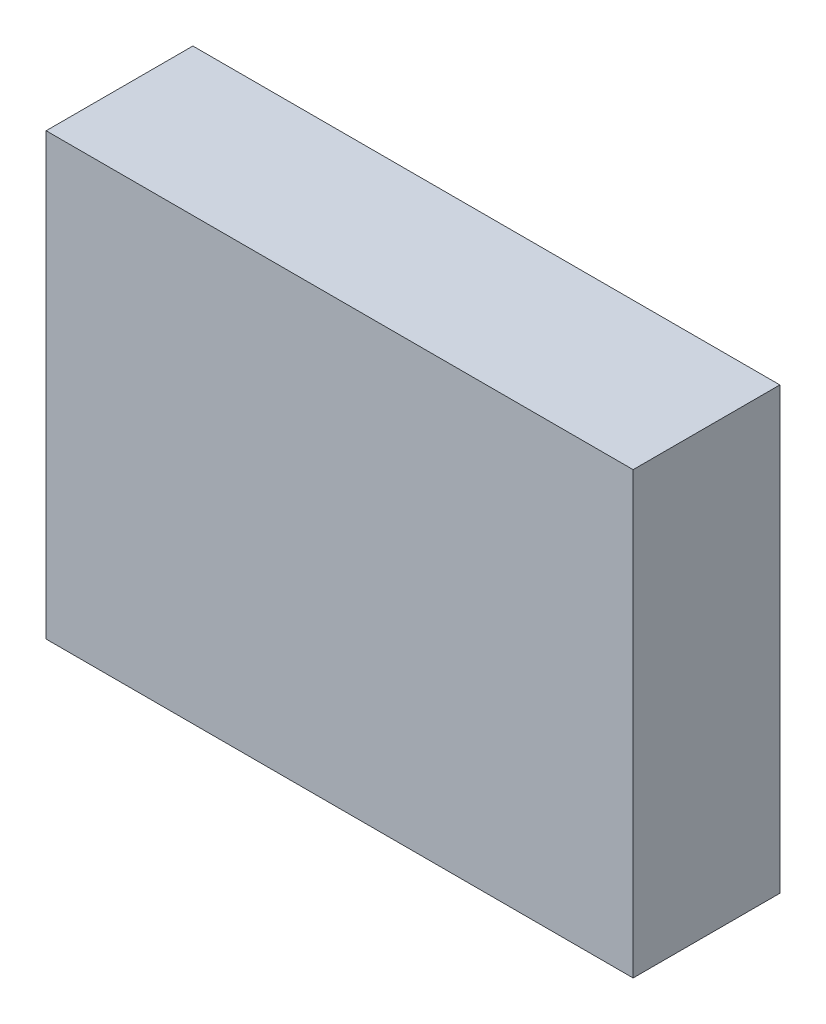
ISO-10303-21;
HEADER;
FILE_DESCRIPTION(('STEP AP214'),'2;1');
FILE_NAME('part.step','',(''),(''),'','','');
FILE_SCHEMA(('AUTOMOTIVE_DESIGN { 1 0 10303 214 1 1 1 1 }'));
ENDSEC;
DATA;
#1=APPLICATION_CONTEXT('core data for automotive mechanical design processes');
#2=APPLICATION_PROTOCOL_DEFINITION('international standard','automotive_design',2000,#1);
#3=PRODUCT_CONTEXT('',#1,'mechanical');
#4=PRODUCT('Part','Part','',(#3));
#5=PRODUCT_RELATED_PRODUCT_CATEGORY('part','',(#4));
#6=PRODUCT_DEFINITION_FORMATION('','',#4);
#7=PRODUCT_DEFINITION_CONTEXT('part definition',#1,'design');
#8=PRODUCT_DEFINITION('design','',#6,#7);
#9=PRODUCT_DEFINITION_SHAPE('','',#8);
#10=(LENGTH_UNIT() NAMED_UNIT(*) SI_UNIT(.MILLI.,.METRE.));
#11=(NAMED_UNIT(*) PLANE_ANGLE_UNIT() SI_UNIT($,.RADIAN.));
#12=(NAMED_UNIT(*) SI_UNIT($,.STERADIAN.) SOLID_ANGLE_UNIT());
#13=UNCERTAINTY_MEASURE_WITH_UNIT(LENGTH_MEASURE(1.E-05),#10,'distance_accuracy_value','');
#14=(GEOMETRIC_REPRESENTATION_CONTEXT(3) GLOBAL_UNCERTAINTY_ASSIGNED_CONTEXT((#13)) GLOBAL_UNIT_ASSIGNED_CONTEXT((#10,
#11,#12)) REPRESENTATION_CONTEXT('',''));
#15=CARTESIAN_POINT('',(0.,0.,0.));
#16=DIRECTION('',(0.,0.,1.));
#17=DIRECTION('',(1.,0.,0.));
#18=AXIS2_PLACEMENT_3D('',#15,#16,#17);
#19=CARTESIAN_POINT('',(-300.,0.,0.));
#20=DIRECTION('',(0.,-1.,0.));
#21=DIRECTION('',(0.,0.,-1.));
#22=AXIS2_PLACEMENT_3D('',#19,#20,#21);
#23=PLANE('',#22);
#24=DIRECTION('',(1.,0.,0.));
#25=VECTOR('',#24,1.);
#26=CARTESIAN_POINT('',(-300.,0.,150.));
#27=LINE('',#26,#25);
#28=CARTESIAN_POINT('',(-300.,0.,150.));
#29=VERTEX_POINT('',#28);
#30=CARTESIAN_POINT('',(300.,0.,150.));
#31=VERTEX_POINT('',#30);
#32=EDGE_CURVE('E46',#29,#31,#27,.T.);
#33=ORIENTED_EDGE('',*,*,#32,.T.);
#34=DIRECTION('',(0.,0.,-1.));
#35=VECTOR('',#34,1.);
#36=CARTESIAN_POINT('',(300.,0.,0.));
#37=LINE('',#36,#35);
#38=CARTESIAN_POINT('',(300.,0.,0.));
#39=VERTEX_POINT('',#38);
#40=EDGE_CURVE('E190',#31,#39,#37,.T.);
#41=ORIENTED_EDGE('',*,*,#40,.T.);
#42=DIRECTION('',(1.,0.,0.));
#43=VECTOR('',#42,1.);
#44=CARTESIAN_POINT('',(-300.,0.,0.));
#45=LINE('',#44,#43);
#46=CARTESIAN_POINT('',(-300.,0.,0.));
#47=VERTEX_POINT('',#46);
#48=EDGE_CURVE('E11',#47,#39,#45,.T.);
#49=ORIENTED_EDGE('',*,*,#48,.F.);
#50=DIRECTION('',(0.,0.,-1.));
#51=VECTOR('',#50,1.);
#52=CARTESIAN_POINT('',(-300.,0.,0.));
#53=LINE('',#52,#51);
#54=EDGE_CURVE('E56',#29,#47,#53,.T.);
#55=ORIENTED_EDGE('',*,*,#54,.F.);
#56=EDGE_LOOP('',(#33,#41,#49,#55));
#57=FACE_BOUND('',#56,.T.);
#58=ADVANCED_FACE('F43',(#57),#23,.F.);
#59=CARTESIAN_POINT('',(-300.,0.,0.));
#60=DIRECTION('',(0.,0.,-1.));
#61=DIRECTION('',(0.,1.,0.));
#62=AXIS2_PLACEMENT_3D('',#59,#60,#61);
#63=PLANE('',#62);
#64=CARTESIAN_POINT('',(-14.9999999999999,-87.5000000000001,0.));
#65=DIRECTION('',(0.,0.,-1.));
#66=DIRECTION('',(0.,1.,0.));
#67=AXIS2_PLACEMENT_3D('',#64,#65,#66);
#68=CIRCLE('',#67,1.025);
#69=CARTESIAN_POINT('',(-14.9999999999999,-86.4750000000001,0.));
#70=VERTEX_POINT('',#69);
#71=EDGE_CURVE('E121',#70,#70,#68,.T.);
#72=ORIENTED_EDGE('',*,*,#71,.F.);
#73=EDGE_LOOP('',(#72));
#74=FACE_BOUND('',#73,.T.);
#75=CARTESIAN_POINT('',(15.,-87.5000000000001,0.));
#76=DIRECTION('',(0.,0.,-1.));
#77=DIRECTION('',(0.,1.,0.));
#78=AXIS2_PLACEMENT_3D('',#75,#76,#77);
#79=CIRCLE('',#78,1.025);
#80=CARTESIAN_POINT('',(15.,-86.4750000000001,0.));
#81=VERTEX_POINT('',#80);
#82=EDGE_CURVE('E120',#81,#81,#79,.T.);
#83=ORIENTED_EDGE('',*,*,#82,.F.);
#84=EDGE_LOOP('',(#83));
#85=FACE_BOUND('',#84,.T.);
#86=CARTESIAN_POINT('',(15.,-12.5,0.));
#87=DIRECTION('',(0.,0.,-1.));
#88=DIRECTION('',(0.,1.,0.));
#89=AXIS2_PLACEMENT_3D('',#86,#87,#88);
#90=CIRCLE('',#89,1.025);
#91=CARTESIAN_POINT('',(15.,-11.475,0.));
#92=VERTEX_POINT('',#91);
#93=EDGE_CURVE('E133',#92,#92,#90,.T.);
#94=ORIENTED_EDGE('',*,*,#93,.F.);
#95=EDGE_LOOP('',(#94));
#96=FACE_BOUND('',#95,.T.);
#97=CARTESIAN_POINT('',(-14.9999999999999,-12.5,0.));
#98=DIRECTION('',(0.,0.,-1.));
#99=DIRECTION('',(0.,1.,0.));
#100=AXIS2_PLACEMENT_3D('',#97,#98,#99);
#101=CIRCLE('',#100,1.025);
#102=CARTESIAN_POINT('',(-14.9999999999999,-11.475,0.));
#103=VERTEX_POINT('',#102);
#104=EDGE_CURVE('E145',#103,#103,#101,.T.);
#105=ORIENTED_EDGE('',*,*,#104,.F.);
#106=EDGE_LOOP('',(#105));
#107=FACE_BOUND('',#106,.T.);
#108=CARTESIAN_POINT('',(-37.5,-305.,1.4767218602E-13));
#109=DIRECTION('',(0.,0.,-1.));
#110=DIRECTION('',(0.,1.,0.));
#111=AXIS2_PLACEMENT_3D('',#108,#109,#110);
#112=CIRCLE('',#111,1.025);
#113=CARTESIAN_POINT('',(-37.5,-303.975,1.4717008083235E-13));
#114=VERTEX_POINT('',#113);
#115=EDGE_CURVE('E151',#114,#114,#112,.T.);
#116=ORIENTED_EDGE('',*,*,#115,.F.);
#117=EDGE_LOOP('',(#116));
#118=FACE_BOUND('',#117,.T.);
#119=CARTESIAN_POINT('',(-37.5,-145.,0.));
#120=DIRECTION('',(0.,0.,-1.));
#121=DIRECTION('',(0.,1.,0.));
#122=AXIS2_PLACEMENT_3D('',#119,#120,#121);
#123=CIRCLE('',#122,1.025);
#124=CARTESIAN_POINT('',(-37.5,-143.975,0.));
#125=VERTEX_POINT('',#124);
#126=EDGE_CURVE('E156',#125,#125,#123,.T.);
#127=ORIENTED_EDGE('',*,*,#126,.F.);
#128=EDGE_LOOP('',(#127));
#129=FACE_BOUND('',#128,.T.);
#130=CARTESIAN_POINT('',(37.5,-305.,1.4767218602E-13));
#131=DIRECTION('',(0.,0.,-1.));
#132=DIRECTION('',(0.,1.,0.));
#133=AXIS2_PLACEMENT_3D('',#130,#131,#132);
#134=CIRCLE('',#133,1.025);
#135=CARTESIAN_POINT('',(37.5,-303.975,1.4717008083235E-13));
#136=VERTEX_POINT('',#135);
#137=EDGE_CURVE('E169',#136,#136,#134,.T.);
#138=ORIENTED_EDGE('',*,*,#137,.F.);
#139=EDGE_LOOP('',(#138));
#140=FACE_BOUND('',#139,.T.);
#141=CARTESIAN_POINT('',(37.5,-145.,0.));
#142=DIRECTION('',(0.,0.,-1.));
#143=DIRECTION('',(0.,1.,0.));
#144=AXIS2_PLACEMENT_3D('',#141,#142,#143);
#145=CIRCLE('',#144,1.025);
#146=CARTESIAN_POINT('',(37.5,-143.975,0.));
#147=VERTEX_POINT('',#146);
#148=EDGE_CURVE('E178',#147,#147,#145,.T.);
#149=ORIENTED_EDGE('',*,*,#148,.F.);
#150=EDGE_LOOP('',(#149));
#151=FACE_BOUND('',#150,.T.);
#152=ORIENTED_EDGE('',*,*,#48,.T.);
#153=DIRECTION('',(0.,1.,0.));
#154=VECTOR('',#153,1.);
#155=CARTESIAN_POINT('',(300.,0.,0.));
#156=LINE('',#155,#154);
#157=CARTESIAN_POINT('',(300.,-450.,0.));
#158=VERTEX_POINT('',#157);
#159=EDGE_CURVE('E196',#158,#39,#156,.T.);
#160=ORIENTED_EDGE('',*,*,#159,.F.);
#161=DIRECTION('',(1.,0.,0.));
#162=VECTOR('',#161,1.);
#163=CARTESIAN_POINT('',(-300.,-450.,0.));
#164=LINE('',#163,#162);
#165=CARTESIAN_POINT('',(-300.,-450.,0.));
#166=VERTEX_POINT('',#165);
#167=EDGE_CURVE('E51',#166,#158,#164,.T.);
#168=ORIENTED_EDGE('',*,*,#167,.F.);
#169=DIRECTION('',(0.,1.,0.));
#170=VECTOR('',#169,1.);
#171=CARTESIAN_POINT('',(-300.,0.,0.));
#172=LINE('',#171,#170);
#173=EDGE_CURVE('E204',#166,#47,#172,.T.);
#174=ORIENTED_EDGE('',*,*,#173,.T.);
#175=EDGE_LOOP('',(#152,#160,#168,#174));
#176=FACE_BOUND('',#175,.T.);
#177=ADVANCED_FACE('F221',(#74,#85,#96,#107,#118,#129,#140,#151,#176),#63,.T.);
#178=CARTESIAN_POINT('',(-300.,-450.,0.));
#179=DIRECTION('',(0.,-1.,0.));
#180=DIRECTION('',(0.,0.,-1.));
#181=AXIS2_PLACEMENT_3D('',#178,#179,#180);
#182=PLANE('',#181);
#183=ORIENTED_EDGE('',*,*,#167,.T.);
#184=DIRECTION('',(0.,0.,-1.));
#185=VECTOR('',#184,1.);
#186=CARTESIAN_POINT('',(300.,-450.,0.));
#187=LINE('',#186,#185);
#188=CARTESIAN_POINT('',(300.,-450.,150.));
#189=VERTEX_POINT('',#188);
#190=EDGE_CURVE('E192',#189,#158,#187,.T.);
#191=ORIENTED_EDGE('',*,*,#190,.F.);
#192=DIRECTION('',(1.,0.,0.));
#193=VECTOR('',#192,1.);
#194=CARTESIAN_POINT('',(-300.,-450.,150.));
#195=LINE('',#194,#193);
#196=CARTESIAN_POINT('',(-300.,-450.,150.));
#197=VERTEX_POINT('',#196);
#198=EDGE_CURVE('E207',#197,#189,#195,.T.);
#199=ORIENTED_EDGE('',*,*,#198,.F.);
#200=DIRECTION('',(0.,0.,-1.));
#201=VECTOR('',#200,1.);
#202=CARTESIAN_POINT('',(-300.,-450.,0.));
#203=LINE('',#202,#201);
#204=EDGE_CURVE('E205',#197,#166,#203,.T.);
#205=ORIENTED_EDGE('',*,*,#204,.T.);
#206=EDGE_LOOP('',(#183,#191,#199,#205));
#207=FACE_BOUND('',#206,.T.);
#208=ADVANCED_FACE('F217',(#207),#182,.T.);
#209=CARTESIAN_POINT('',(-300.,0.,150.));
#210=DIRECTION('',(0.,0.,-1.));
#211=DIRECTION('',(-1.,0.,0.));
#212=AXIS2_PLACEMENT_3D('',#209,#210,#211);
#213=PLANE('',#212);
#214=ORIENTED_EDGE('',*,*,#198,.T.);
#215=DIRECTION('',(0.,1.,0.));
#216=VECTOR('',#215,1.);
#217=CARTESIAN_POINT('',(300.,0.,150.));
#218=LINE('',#217,#216);
#219=EDGE_CURVE('E188',#189,#31,#218,.T.);
#220=ORIENTED_EDGE('',*,*,#219,.T.);
#221=ORIENTED_EDGE('',*,*,#32,.F.);
#222=DIRECTION('',(0.,1.,0.));
#223=VECTOR('',#222,1.);
#224=CARTESIAN_POINT('',(-300.,0.,150.));
#225=LINE('',#224,#223);
#226=EDGE_CURVE('E199',#197,#29,#225,.T.);
#227=ORIENTED_EDGE('',*,*,#226,.F.);
#228=EDGE_LOOP('',(#214,#220,#221,#227));
#229=FACE_BOUND('',#228,.T.);
#230=ADVANCED_FACE('F216',(#229),#213,.F.);
#231=CARTESIAN_POINT('',(-300.,0.,0.));
#232=DIRECTION('',(1.,0.,0.));
#233=DIRECTION('',(0.,0.,-1.));
#234=AXIS2_PLACEMENT_3D('',#231,#232,#233);
#235=PLANE('',#234);
#236=ORIENTED_EDGE('',*,*,#54,.T.);
#237=ORIENTED_EDGE('',*,*,#173,.F.);
#238=ORIENTED_EDGE('',*,*,#204,.F.);
#239=ORIENTED_EDGE('',*,*,#226,.T.);
#240=EDGE_LOOP('',(#236,#237,#238,#239));
#241=FACE_BOUND('',#240,.T.);
#242=ADVANCED_FACE('F218',(#241),#235,.F.);
#243=CARTESIAN_POINT('',(300.,0.,0.));
#244=DIRECTION('',(1.,0.,0.));
#245=DIRECTION('',(0.,0.,-1.));
#246=AXIS2_PLACEMENT_3D('',#243,#244,#245);
#247=PLANE('',#246);
#248=ORIENTED_EDGE('',*,*,#40,.F.);
#249=ORIENTED_EDGE('',*,*,#219,.F.);
#250=ORIENTED_EDGE('',*,*,#190,.T.);
#251=ORIENTED_EDGE('',*,*,#159,.T.);
#252=EDGE_LOOP('',(#248,#249,#250,#251));
#253=FACE_BOUND('',#252,.T.);
#254=ADVANCED_FACE('F214',(#253),#247,.T.);
#255=CARTESIAN_POINT('',(37.5,-145.,10.0000000000001));
#256=DIRECTION('',(0.,0.,-1.));
#257=DIRECTION('',(0.,1.,0.));
#258=AXIS2_PLACEMENT_3D('',#255,#256,#257);
#259=CONICAL_SURFACE('',#258,0.999999999999994,1.02974425867665);
#260=CARTESIAN_POINT('',(37.5,-145.,10.6008606190276));
#261=VERTEX_POINT('',#260);
#262=VERTEX_LOOP('',#261);
#263=FACE_BOUND('',#262,.T.);
#264=CARTESIAN_POINT('',(37.5,-145.,10.0000000000001));
#265=DIRECTION('',(0.,0.,-1.));
#266=DIRECTION('',(0.,1.,0.));
#267=AXIS2_PLACEMENT_3D('',#264,#265,#266);
#268=CIRCLE('',#267,0.999999999999994);
#269=CARTESIAN_POINT('',(37.5,-144.,10.0000000000001));
#270=VERTEX_POINT('',#269);
#271=EDGE_CURVE('E183',#270,#270,#268,.T.);
#272=ORIENTED_EDGE('',*,*,#271,.T.);
#273=EDGE_LOOP('',(#272));
#274=FACE_BOUND('',#273,.T.);
#275=ADVANCED_FACE('F243',(#263,#274),#259,.F.);
#276=CARTESIAN_POINT('',(37.5,-145.,0.));
#277=DIRECTION('',(0.,0.,-1.));
#278=DIRECTION('',(0.,1.,0.));
#279=AXIS2_PLACEMENT_3D('',#276,#277,#278);
#280=CYLINDRICAL_SURFACE('',#279,0.99999999999999);
#281=ORIENTED_EDGE('',*,*,#271,.F.);
#282=EDGE_LOOP('',(#281));
#283=FACE_BOUND('',#282,.T.);
#284=CARTESIAN_POINT('',(37.5,-145.,0.0250000000000822));
#285=DIRECTION('',(0.,0.,-1.));
#286=DIRECTION('',(0.,1.,0.));
#287=AXIS2_PLACEMENT_3D('',#284,#285,#286);
#288=CIRCLE('',#287,0.999999999999987);
#289=CARTESIAN_POINT('',(37.5,-144.,0.0250000000000817));
#290=VERTEX_POINT('',#289);
#291=EDGE_CURVE('E181',#290,#290,#288,.T.);
#292=ORIENTED_EDGE('',*,*,#291,.T.);
#293=EDGE_LOOP('',(#292));
#294=FACE_BOUND('',#293,.T.);
#295=ADVANCED_FACE('F246',(#283,#294),#280,.F.);
#296=CARTESIAN_POINT('',(37.5,-145.,0.));
#297=DIRECTION('',(0.,0.,-1.));
#298=DIRECTION('',(0.,1.,0.));
#299=AXIS2_PLACEMENT_3D('',#296,#297,#298);
#300=CONICAL_SURFACE('',#299,1.025,0.785398163397414);
#301=ORIENTED_EDGE('',*,*,#291,.F.);
#302=EDGE_LOOP('',(#301));
#303=FACE_BOUND('',#302,.T.);
#304=ORIENTED_EDGE('',*,*,#148,.T.);
#305=EDGE_LOOP('',(#304));
#306=FACE_BOUND('',#305,.T.);
#307=ADVANCED_FACE('F249',(#303,#306),#300,.F.);
#308=CARTESIAN_POINT('',(37.5,-305.,10.0000000000001));
#309=DIRECTION('',(0.,0.,-1.));
#310=DIRECTION('',(0.,1.,0.));
#311=AXIS2_PLACEMENT_3D('',#308,#309,#310);
#312=CONICAL_SURFACE('',#311,0.999999999999994,1.02974425867665);
#313=CARTESIAN_POINT('',(37.5,-305.,10.6008606190277));
#314=VERTEX_POINT('',#313);
#315=VERTEX_LOOP('',#314);
#316=FACE_BOUND('',#315,.T.);
#317=CARTESIAN_POINT('',(37.5,-305.,10.0000000000001));
#318=DIRECTION('',(0.,0.,-1.));
#319=DIRECTION('',(0.,1.,0.));
#320=AXIS2_PLACEMENT_3D('',#317,#318,#319);
#321=CIRCLE('',#320,0.999999999999994);
#322=CARTESIAN_POINT('',(37.5,-304.,10.0000000000001));
#323=VERTEX_POINT('',#322);
#324=EDGE_CURVE('E174',#323,#323,#321,.T.);
#325=ORIENTED_EDGE('',*,*,#324,.T.);
#326=EDGE_LOOP('',(#325));
#327=FACE_BOUND('',#326,.T.);
#328=ADVANCED_FACE('F251',(#316,#327),#312,.F.);
#329=CARTESIAN_POINT('',(37.5,-305.,1.49406909495977E-13));
#330=DIRECTION('',(0.,0.,-1.));
#331=DIRECTION('',(0.,1.,0.));
#332=AXIS2_PLACEMENT_3D('',#329,#330,#331);
#333=CYLINDRICAL_SURFACE('',#332,0.99999999999999);
#334=ORIENTED_EDGE('',*,*,#324,.F.);
#335=EDGE_LOOP('',(#334));
#336=FACE_BOUND('',#335,.T.);
#337=CARTESIAN_POINT('',(37.5,-305.,0.0250000000001605));
#338=DIRECTION('',(0.,0.,-1.));
#339=DIRECTION('',(0.,1.,0.));
#340=AXIS2_PLACEMENT_3D('',#337,#338,#339);
#341=CIRCLE('',#340,0.999999999999987);
#342=CARTESIAN_POINT('',(37.5,-304.,0.02500000000016));
#343=VERTEX_POINT('',#342);
#344=EDGE_CURVE('E175',#343,#343,#341,.T.);
#345=ORIENTED_EDGE('',*,*,#344,.T.);
#346=EDGE_LOOP('',(#345));
#347=FACE_BOUND('',#346,.T.);
#348=ADVANCED_FACE('F257',(#336,#347),#333,.F.);
#349=CARTESIAN_POINT('',(37.5,-305.,1.4767218602E-13));
#350=DIRECTION('',(0.,0.,-1.));
#351=DIRECTION('',(0.,1.,0.));
#352=AXIS2_PLACEMENT_3D('',#349,#350,#351);
#353=CONICAL_SURFACE('',#352,1.025,0.785398163397414);
#354=ORIENTED_EDGE('',*,*,#344,.F.);
#355=EDGE_LOOP('',(#354));
#356=FACE_BOUND('',#355,.T.);
#357=ORIENTED_EDGE('',*,*,#137,.T.);
#358=EDGE_LOOP('',(#357));
#359=FACE_BOUND('',#358,.T.);
#360=ADVANCED_FACE('F265',(#356,#359),#353,.F.);
#361=CARTESIAN_POINT('',(-37.5,-145.,10.0000000000001));
#362=DIRECTION('',(0.,0.,-1.));
#363=DIRECTION('',(0.,1.,0.));
#364=AXIS2_PLACEMENT_3D('',#361,#362,#363);
#365=CONICAL_SURFACE('',#364,0.999999999999994,1.02974425867665);
#366=CARTESIAN_POINT('',(-37.5,-145.,10.6008606190276));
#367=VERTEX_POINT('',#366);
#368=VERTEX_LOOP('',#367);
#369=FACE_BOUND('',#368,.T.);
#370=CARTESIAN_POINT('',(-37.5,-145.,10.0000000000001));
#371=DIRECTION('',(0.,0.,-1.));
#372=DIRECTION('',(0.,1.,0.));
#373=AXIS2_PLACEMENT_3D('',#370,#371,#372);
#374=CIRCLE('',#373,0.999999999999994);
#375=CARTESIAN_POINT('',(-37.5,-144.,10.0000000000001));
#376=VERTEX_POINT('',#375);
#377=EDGE_CURVE('E168',#376,#376,#374,.T.);
#378=ORIENTED_EDGE('',*,*,#377,.T.);
#379=EDGE_LOOP('',(#378));
#380=FACE_BOUND('',#379,.T.);
#381=ADVANCED_FACE('F267',(#369,#380),#365,.F.);
#382=CARTESIAN_POINT('',(-37.5,-145.,0.));
#383=DIRECTION('',(0.,0.,-1.));
#384=DIRECTION('',(0.,1.,0.));
#385=AXIS2_PLACEMENT_3D('',#382,#383,#384);
#386=CYLINDRICAL_SURFACE('',#385,0.99999999999999);
#387=ORIENTED_EDGE('',*,*,#377,.F.);
#388=EDGE_LOOP('',(#387));
#389=FACE_BOUND('',#388,.T.);
#390=CARTESIAN_POINT('',(-37.5,-145.,0.0250000000000822));
#391=DIRECTION('',(0.,0.,-1.));
#392=DIRECTION('',(0.,1.,0.));
#393=AXIS2_PLACEMENT_3D('',#390,#391,#392);
#394=CIRCLE('',#393,0.999999999999987);
#395=CARTESIAN_POINT('',(-37.5,-144.,0.0250000000000817));
#396=VERTEX_POINT('',#395);
#397=EDGE_CURVE('E161',#396,#396,#394,.T.);
#398=ORIENTED_EDGE('',*,*,#397,.T.);
#399=EDGE_LOOP('',(#398));
#400=FACE_BOUND('',#399,.T.);
#401=ADVANCED_FACE('F266',(#389,#400),#386,.F.);
#402=CARTESIAN_POINT('',(-37.5,-145.,0.));
#403=DIRECTION('',(0.,0.,-1.));
#404=DIRECTION('',(0.,1.,0.));
#405=AXIS2_PLACEMENT_3D('',#402,#403,#404);
#406=CONICAL_SURFACE('',#405,1.025,0.785398163397414);
#407=ORIENTED_EDGE('',*,*,#397,.F.);
#408=EDGE_LOOP('',(#407));
#409=FACE_BOUND('',#408,.T.);
#410=ORIENTED_EDGE('',*,*,#126,.T.);
#411=EDGE_LOOP('',(#410));
#412=FACE_BOUND('',#411,.T.);
#413=ADVANCED_FACE('F274',(#409,#412),#406,.F.);
#414=CARTESIAN_POINT('',(-37.5,-305.,10.0000000000001));
#415=DIRECTION('',(0.,0.,-1.));
#416=DIRECTION('',(0.,1.,0.));
#417=AXIS2_PLACEMENT_3D('',#414,#415,#416);
#418=CONICAL_SURFACE('',#417,0.999999999999994,1.02974425867665);
#419=CARTESIAN_POINT('',(-37.5,-305.,10.6008606190277));
#420=VERTEX_POINT('',#419);
#421=VERTEX_LOOP('',#420);
#422=FACE_BOUND('',#421,.T.);
#423=CARTESIAN_POINT('',(-37.5,-305.,10.0000000000001));
#424=DIRECTION('',(0.,0.,-1.));
#425=DIRECTION('',(0.,1.,0.));
#426=AXIS2_PLACEMENT_3D('',#423,#424,#425);
#427=CIRCLE('',#426,0.999999999999994);
#428=CARTESIAN_POINT('',(-37.5,-304.,10.0000000000001));
#429=VERTEX_POINT('',#428);
#430=EDGE_CURVE('E160',#429,#429,#427,.T.);
#431=ORIENTED_EDGE('',*,*,#430,.T.);
#432=EDGE_LOOP('',(#431));
#433=FACE_BOUND('',#432,.T.);
#434=ADVANCED_FACE('F277',(#422,#433),#418,.F.);
#435=CARTESIAN_POINT('',(-37.5,-305.,1.49406909495977E-13));
#436=DIRECTION('',(0.,0.,-1.));
#437=DIRECTION('',(0.,1.,0.));
#438=AXIS2_PLACEMENT_3D('',#435,#436,#437);
#439=CYLINDRICAL_SURFACE('',#438,0.99999999999999);
#440=ORIENTED_EDGE('',*,*,#430,.F.);
#441=EDGE_LOOP('',(#440));
#442=FACE_BOUND('',#441,.T.);
#443=CARTESIAN_POINT('',(-37.5,-305.,0.0250000000001605));
#444=DIRECTION('',(0.,0.,-1.));
#445=DIRECTION('',(0.,1.,0.));
#446=AXIS2_PLACEMENT_3D('',#443,#444,#445);
#447=CIRCLE('',#446,0.999999999999987);
#448=CARTESIAN_POINT('',(-37.5,-304.,0.02500000000016));
#449=VERTEX_POINT('',#448);
#450=EDGE_CURVE('E152',#449,#449,#447,.T.);
#451=ORIENTED_EDGE('',*,*,#450,.T.);
#452=EDGE_LOOP('',(#451));
#453=FACE_BOUND('',#452,.T.);
#454=ADVANCED_FACE('F285',(#442,#453),#439,.F.);
#455=CARTESIAN_POINT('',(-37.5,-305.,1.4767218602E-13));
#456=DIRECTION('',(0.,0.,-1.));
#457=DIRECTION('',(0.,1.,0.));
#458=AXIS2_PLACEMENT_3D('',#455,#456,#457);
#459=CONICAL_SURFACE('',#458,1.025,0.785398163397414);
#460=ORIENTED_EDGE('',*,*,#450,.F.);
#461=EDGE_LOOP('',(#460));
#462=FACE_BOUND('',#461,.T.);
#463=ORIENTED_EDGE('',*,*,#115,.T.);
#464=EDGE_LOOP('',(#463));
#465=FACE_BOUND('',#464,.T.);
#466=ADVANCED_FACE('F287',(#462,#465),#459,.F.);
#467=CARTESIAN_POINT('',(-14.9999999999999,-12.5,10.));
#468=DIRECTION('',(0.,0.,-1.));
#469=DIRECTION('',(0.,1.,0.));
#470=AXIS2_PLACEMENT_3D('',#467,#468,#469);
#471=CONICAL_SURFACE('',#470,0.999999999999987,1.02974425867664);
#472=CARTESIAN_POINT('',(-14.9999999999999,-12.5,10.6008606190276));
#473=VERTEX_POINT('',#472);
#474=VERTEX_LOOP('',#473);
#475=FACE_BOUND('',#474,.T.);
#476=CARTESIAN_POINT('',(-14.9999999999999,-12.5,10.));
#477=DIRECTION('',(0.,0.,-1.));
#478=DIRECTION('',(0.,1.,0.));
#479=AXIS2_PLACEMENT_3D('',#476,#477,#478);
#480=CIRCLE('',#479,0.999999999999987);
#481=CARTESIAN_POINT('',(-14.9999999999999,-11.5,10.));
#482=VERTEX_POINT('',#481);
#483=EDGE_CURVE('E147',#482,#482,#480,.T.);
#484=ORIENTED_EDGE('',*,*,#483,.T.);
#485=EDGE_LOOP('',(#484));
#486=FACE_BOUND('',#485,.T.);
#487=ADVANCED_FACE('F289',(#475,#486),#471,.F.);
#488=CARTESIAN_POINT('',(-14.9999999999999,-12.5,0.));
#489=DIRECTION('',(0.,0.,-1.));
#490=DIRECTION('',(0.,1.,0.));
#491=AXIS2_PLACEMENT_3D('',#488,#489,#490);
#492=CYLINDRICAL_SURFACE('',#491,0.999999999999988);
#493=ORIENTED_EDGE('',*,*,#483,.F.);
#494=EDGE_LOOP('',(#493));
#495=FACE_BOUND('',#494,.T.);
#496=CARTESIAN_POINT('',(-14.9999999999999,-12.5,0.0250000000000172));
#497=DIRECTION('',(0.,0.,-1.));
#498=DIRECTION('',(0.,1.,0.));
#499=AXIS2_PLACEMENT_3D('',#496,#497,#498);
#500=CIRCLE('',#499,0.999999999999989);
#501=CARTESIAN_POINT('',(-14.9999999999999,-11.5,0.0250000000000168));
#502=VERTEX_POINT('',#501);
#503=EDGE_CURVE('E143',#502,#502,#500,.T.);
#504=ORIENTED_EDGE('',*,*,#503,.T.);
#505=EDGE_LOOP('',(#504));
#506=FACE_BOUND('',#505,.T.);
#507=ADVANCED_FACE('F292',(#495,#506),#492,.F.);
#508=CARTESIAN_POINT('',(-14.9999999999999,-12.5,0.));
#509=DIRECTION('',(0.,0.,-1.));
#510=DIRECTION('',(0.,1.,0.));
#511=AXIS2_PLACEMENT_3D('',#508,#509,#510);
#512=CONICAL_SURFACE('',#511,1.025,0.785398163397414);
#513=ORIENTED_EDGE('',*,*,#503,.F.);
#514=EDGE_LOOP('',(#513));
#515=FACE_BOUND('',#514,.T.);
#516=ORIENTED_EDGE('',*,*,#104,.T.);
#517=EDGE_LOOP('',(#516));
#518=FACE_BOUND('',#517,.T.);
#519=ADVANCED_FACE('F298',(#515,#518),#512,.F.);
#520=CARTESIAN_POINT('',(15.,-12.5,10.));
#521=DIRECTION('',(0.,0.,-1.));
#522=DIRECTION('',(0.,1.,0.));
#523=AXIS2_PLACEMENT_3D('',#520,#521,#522);
#524=CONICAL_SURFACE('',#523,0.999999999999987,1.02974425867664);
#525=CARTESIAN_POINT('',(15.,-12.5,10.6008606190276));
#526=VERTEX_POINT('',#525);
#527=VERTEX_LOOP('',#526);
#528=FACE_BOUND('',#527,.T.);
#529=CARTESIAN_POINT('',(15.,-12.5,10.));
#530=DIRECTION('',(0.,0.,-1.));
#531=DIRECTION('',(0.,1.,0.));
#532=AXIS2_PLACEMENT_3D('',#529,#530,#531);
#533=CIRCLE('',#532,0.999999999999987);
#534=CARTESIAN_POINT('',(15.,-11.5,10.));
#535=VERTEX_POINT('',#534);
#536=EDGE_CURVE('E139',#535,#535,#533,.T.);
#537=ORIENTED_EDGE('',*,*,#536,.T.);
#538=EDGE_LOOP('',(#537));
#539=FACE_BOUND('',#538,.T.);
#540=ADVANCED_FACE('F297',(#528,#539),#524,.F.);
#541=CARTESIAN_POINT('',(15.,-12.5,0.));
#542=DIRECTION('',(0.,0.,-1.));
#543=DIRECTION('',(0.,1.,0.));
#544=AXIS2_PLACEMENT_3D('',#541,#542,#543);
#545=CYLINDRICAL_SURFACE('',#544,0.999999999999989);
#546=ORIENTED_EDGE('',*,*,#536,.F.);
#547=EDGE_LOOP('',(#546));
#548=FACE_BOUND('',#547,.T.);
#549=CARTESIAN_POINT('',(15.,-12.5,0.0250000000000172));
#550=DIRECTION('',(0.,0.,-1.));
#551=DIRECTION('',(0.,1.,0.));
#552=AXIS2_PLACEMENT_3D('',#549,#550,#551);
#553=CIRCLE('',#552,0.99999999999999);
#554=CARTESIAN_POINT('',(15.,-11.5,0.0250000000000168));
#555=VERTEX_POINT('',#554);
#556=EDGE_CURVE('E137',#555,#555,#553,.T.);
#557=ORIENTED_EDGE('',*,*,#556,.T.);
#558=EDGE_LOOP('',(#557));
#559=FACE_BOUND('',#558,.T.);
#560=ADVANCED_FACE('F302',(#548,#559),#545,.F.);
#561=CARTESIAN_POINT('',(15.,-12.5,0.));
#562=DIRECTION('',(0.,0.,-1.));
#563=DIRECTION('',(0.,1.,0.));
#564=AXIS2_PLACEMENT_3D('',#561,#562,#563);
#565=CONICAL_SURFACE('',#564,1.025,0.785398163397414);
#566=ORIENTED_EDGE('',*,*,#556,.F.);
#567=EDGE_LOOP('',(#566));
#568=FACE_BOUND('',#567,.T.);
#569=ORIENTED_EDGE('',*,*,#93,.T.);
#570=EDGE_LOOP('',(#569));
#571=FACE_BOUND('',#570,.T.);
#572=ADVANCED_FACE('F308',(#568,#571),#565,.F.);
#573=CARTESIAN_POINT('',(15.,-87.5000000000001,10.));
#574=DIRECTION('',(0.,0.,-1.));
#575=DIRECTION('',(0.,1.,0.));
#576=AXIS2_PLACEMENT_3D('',#573,#574,#575);
#577=CONICAL_SURFACE('',#576,0.999999999999987,1.02974425867664);
#578=CARTESIAN_POINT('',(15.,-87.5000000000001,10.6008606190276));
#579=VERTEX_POINT('',#578);
#580=VERTEX_LOOP('',#579);
#581=FACE_BOUND('',#580,.T.);
#582=CARTESIAN_POINT('',(15.,-87.5000000000001,10.));
#583=DIRECTION('',(0.,0.,-1.));
#584=DIRECTION('',(0.,1.,0.));
#585=AXIS2_PLACEMENT_3D('',#582,#583,#584);
#586=CIRCLE('',#585,0.999999999999987);
#587=CARTESIAN_POINT('',(15.,-86.5000000000001,10.));
#588=VERTEX_POINT('',#587);
#589=EDGE_CURVE('E129',#588,#588,#586,.T.);
#590=ORIENTED_EDGE('',*,*,#589,.T.);
#591=EDGE_LOOP('',(#590));
#592=FACE_BOUND('',#591,.T.);
#593=ADVANCED_FACE('F315',(#581,#592),#577,.F.);
#594=CARTESIAN_POINT('',(15.,-87.5000000000001,0.));
#595=DIRECTION('',(0.,0.,-1.));
#596=DIRECTION('',(0.,1.,0.));
#597=AXIS2_PLACEMENT_3D('',#594,#595,#596);
#598=CYLINDRICAL_SURFACE('',#597,0.999999999999989);
#599=ORIENTED_EDGE('',*,*,#589,.F.);
#600=EDGE_LOOP('',(#599));
#601=FACE_BOUND('',#600,.T.);
#602=CARTESIAN_POINT('',(15.,-87.5000000000001,0.025000000000054));
#603=DIRECTION('',(0.,0.,-1.));
#604=DIRECTION('',(0.,1.,0.));
#605=AXIS2_PLACEMENT_3D('',#602,#603,#604);
#606=CIRCLE('',#605,0.99999999999999);
#607=CARTESIAN_POINT('',(15.,-86.5000000000001,0.0250000000000535));
#608=VERTEX_POINT('',#607);
#609=EDGE_CURVE('E122',#608,#608,#606,.T.);
#610=ORIENTED_EDGE('',*,*,#609,.T.);
#611=EDGE_LOOP('',(#610));
#612=FACE_BOUND('',#611,.T.);
#613=ADVANCED_FACE('F317',(#601,#612),#598,.F.);
#614=CARTESIAN_POINT('',(15.,-87.5000000000001,0.));
#615=DIRECTION('',(0.,0.,-1.));
#616=DIRECTION('',(0.,1.,0.));
#617=AXIS2_PLACEMENT_3D('',#614,#615,#616);
#618=CONICAL_SURFACE('',#617,1.025,0.785398163397414);
#619=ORIENTED_EDGE('',*,*,#609,.F.);
#620=EDGE_LOOP('',(#619));
#621=FACE_BOUND('',#620,.T.);
#622=ORIENTED_EDGE('',*,*,#82,.T.);
#623=EDGE_LOOP('',(#622));
#624=FACE_BOUND('',#623,.T.);
#625=ADVANCED_FACE('F111',(#621,#624),#618,.F.);
#626=CARTESIAN_POINT('',(-14.9999999999999,-87.5000000000001,10.));
#627=DIRECTION('',(0.,0.,-1.));
#628=DIRECTION('',(0.,1.,0.));
#629=AXIS2_PLACEMENT_3D('',#626,#627,#628);
#630=CONICAL_SURFACE('',#629,0.999999999999987,1.02974425867664);
#631=CARTESIAN_POINT('',(-14.9999999999999,-87.5000000000001,10.6008606190276));
#632=VERTEX_POINT('',#631);
#633=VERTEX_LOOP('',#632);
#634=FACE_BOUND('',#633,.T.);
#635=CARTESIAN_POINT('',(-14.9999999999999,-87.5000000000001,10.));
#636=DIRECTION('',(0.,0.,-1.));
#637=DIRECTION('',(0.,1.,0.));
#638=AXIS2_PLACEMENT_3D('',#635,#636,#637);
#639=CIRCLE('',#638,0.999999999999987);
#640=CARTESIAN_POINT('',(-14.9999999999999,-86.5000000000001,10.));
#641=VERTEX_POINT('',#640);
#642=EDGE_CURVE('E114',#641,#641,#639,.T.);
#643=ORIENTED_EDGE('',*,*,#642,.T.);
#644=EDGE_LOOP('',(#643));
#645=FACE_BOUND('',#644,.T.);
#646=ADVANCED_FACE('F110',(#634,#645),#630,.F.);
#647=CARTESIAN_POINT('',(-14.9999999999999,-87.5000000000001,0.));
#648=DIRECTION('',(0.,0.,-1.));
#649=DIRECTION('',(0.,1.,0.));
#650=AXIS2_PLACEMENT_3D('',#647,#648,#649);
#651=CYLINDRICAL_SURFACE('',#650,0.999999999999988);
#652=ORIENTED_EDGE('',*,*,#642,.F.);
#653=EDGE_LOOP('',(#652));
#654=FACE_BOUND('',#653,.T.);
#655=CARTESIAN_POINT('',(-14.9999999999999,-87.5000000000001,0.025000000000054));
#656=DIRECTION('',(0.,0.,-1.));
#657=DIRECTION('',(0.,1.,0.));
#658=AXIS2_PLACEMENT_3D('',#655,#656,#657);
#659=CIRCLE('',#658,0.999999999999989);
#660=CARTESIAN_POINT('',(-14.9999999999999,-86.5000000000001,0.0250000000000535));
#661=VERTEX_POINT('',#660);
#662=EDGE_CURVE('E117',#661,#661,#659,.T.);
#663=ORIENTED_EDGE('',*,*,#662,.T.);
#664=EDGE_LOOP('',(#663));
#665=FACE_BOUND('',#664,.T.);
#666=ADVANCED_FACE('F109',(#654,#665),#651,.F.);
#667=CARTESIAN_POINT('',(-14.9999999999999,-87.5000000000001,0.));
#668=DIRECTION('',(0.,0.,-1.));
#669=DIRECTION('',(0.,1.,0.));
#670=AXIS2_PLACEMENT_3D('',#667,#668,#669);
#671=CONICAL_SURFACE('',#670,1.025,0.785398163397414);
#672=ORIENTED_EDGE('',*,*,#662,.F.);
#673=EDGE_LOOP('',(#672));
#674=FACE_BOUND('',#673,.T.);
#675=ORIENTED_EDGE('',*,*,#71,.T.);
#676=EDGE_LOOP('',(#675));
#677=FACE_BOUND('',#676,.T.);
#678=ADVANCED_FACE('F326',(#674,#677),#671,.F.);
#679=CLOSED_SHELL('',(#58,#177,#208,#230,#242,#254,#275,#295,#307,#328,#348,#360,#381,#401,#413,
#434,#454,#466,#487,#507,#519,#540,#560,#572,#593,#613,#625,#646,#666,#678));
#680=MANIFOLD_SOLID_BREP('B2',#679);
#681=ADVANCED_BREP_SHAPE_REPRESENTATION('',(#18,#680),#14);
#682=SHAPE_DEFINITION_REPRESENTATION(#9,#681);
ENDSEC;
END-ISO-10303-21;
